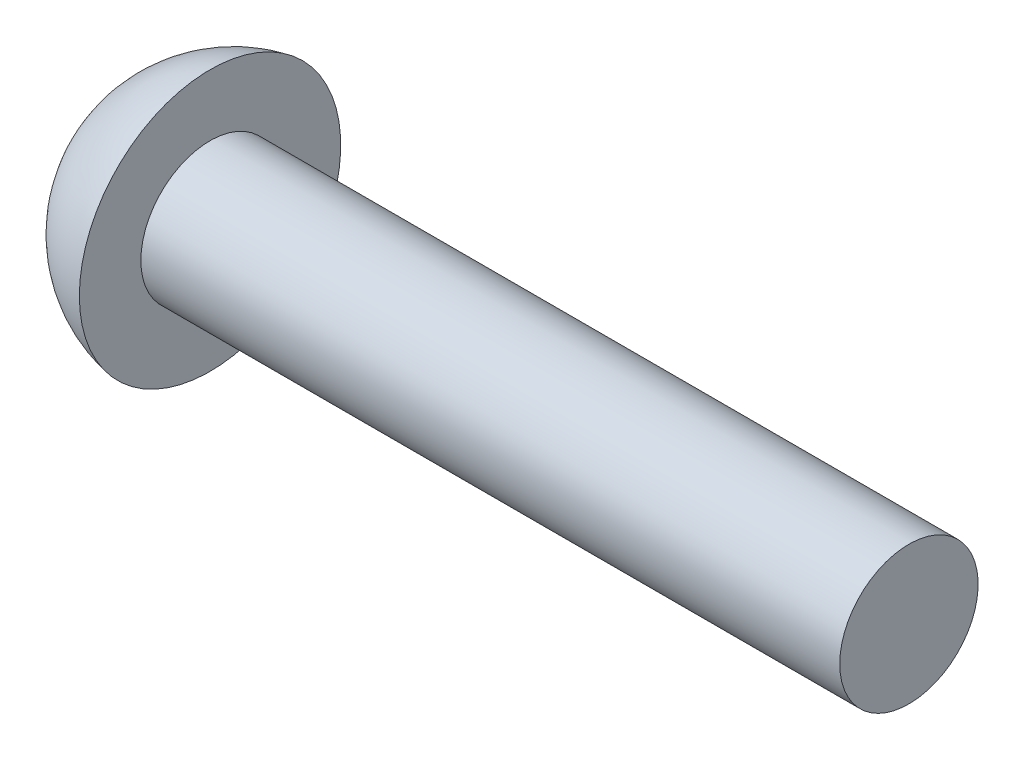
ISO-10303-21;
HEADER;
FILE_DESCRIPTION(('STEP AP214'),'2;1');
FILE_NAME('part.step','',(''),(''),'','','');
FILE_SCHEMA(('AUTOMOTIVE_DESIGN { 1 0 10303 214 1 1 1 1 }'));
ENDSEC;
DATA;
#1=APPLICATION_CONTEXT('core data for automotive mechanical design processes');
#2=APPLICATION_PROTOCOL_DEFINITION('international standard','automotive_design',2000,#1);
#3=PRODUCT_CONTEXT('',#1,'mechanical');
#4=PRODUCT('Part','Part','',(#3));
#5=PRODUCT_RELATED_PRODUCT_CATEGORY('part','',(#4));
#6=PRODUCT_DEFINITION_FORMATION('','',#4);
#7=PRODUCT_DEFINITION_CONTEXT('part definition',#1,'design');
#8=PRODUCT_DEFINITION('design','',#6,#7);
#9=PRODUCT_DEFINITION_SHAPE('','',#8);
#10=(LENGTH_UNIT() NAMED_UNIT(*) SI_UNIT(.MILLI.,.METRE.));
#11=(NAMED_UNIT(*) PLANE_ANGLE_UNIT() SI_UNIT($,.RADIAN.));
#12=(NAMED_UNIT(*) SI_UNIT($,.STERADIAN.) SOLID_ANGLE_UNIT());
#13=UNCERTAINTY_MEASURE_WITH_UNIT(LENGTH_MEASURE(1.E-05),#10,'distance_accuracy_value','');
#14=(GEOMETRIC_REPRESENTATION_CONTEXT(3) GLOBAL_UNCERTAINTY_ASSIGNED_CONTEXT((#13)) GLOBAL_UNIT_ASSIGNED_CONTEXT((#10,
#11,#12)) REPRESENTATION_CONTEXT('',''));
#15=CARTESIAN_POINT('',(0.,0.,0.));
#16=DIRECTION('',(0.,0.,1.));
#17=DIRECTION('',(1.,0.,0.));
#18=AXIS2_PLACEMENT_3D('',#15,#16,#17);
#19=CARTESIAN_POINT('',(2.41401762820514,0.,0.));
#20=DIRECTION('',(-1.,0.,0.));
#21=DIRECTION('',(0.,1.,0.));
#22=AXIS2_PLACEMENT_3D('',#19,#20,#21);
#23=SPHERICAL_SURFACE('',#22,2.41401762820514);
#24=CARTESIAN_POINT('',(1.9812,0.,0.));
#25=DIRECTION('',(-1.,0.,0.));
#26=DIRECTION('',(0.,0.,1.));
#27=AXIS2_PLACEMENT_3D('',#24,#25,#26);
#28=CIRCLE('',#27,2.3749);
#29=CARTESIAN_POINT('',(1.9812,0.,2.3749));
#30=VERTEX_POINT('',#29);
#31=EDGE_CURVE('E179',#30,#30,#28,.T.);
#32=ORIENTED_EDGE('',*,*,#31,.T.);
#33=EDGE_LOOP('',(#32));
#34=FACE_BOUND('',#33,.T.);
#35=CARTESIAN_POINT('',(2.42396078078378,0.,0.0986949959658133));
#36=DIRECTION('',(-0.100238850281225,0.,-0.994963402791428));
#37=DIRECTION('',(-0.994963402791428,0.,0.100238850281225));
#38=AXIS2_PLACEMENT_3D('',#35,#36,#37);
#39=CIRCLE('',#38,2.41197876043162);
#40=CARTESIAN_POINT('',(0.370965507232678,1.24902867511384,0.305526609345961));
#41=VERTEX_POINT('',#40);
#42=CARTESIAN_POINT('',(0.0478219323177577,0.338082118759031,0.338082118759031));
#43=VERTEX_POINT('',#42);
#44=EDGE_CURVE('E144',#41,#43,#39,.F.);
#45=ORIENTED_EDGE('',*,*,#44,.T.);
#46=CARTESIAN_POINT('',(2.42396078078378,0.0986949959658128,0.));
#47=DIRECTION('',(-0.100238850281226,-0.994963402791428,0.));
#48=DIRECTION('',(0.994963402791428,-0.100238850281226,0.));
#49=AXIS2_PLACEMENT_3D('',#46,#47,#48);
#50=CIRCLE('',#49,2.41197876043162);
#51=CARTESIAN_POINT('',(0.370965507232676,0.305526609345957,1.24902867511384));
#52=VERTEX_POINT('',#51);
#53=EDGE_CURVE('E125',#43,#52,#50,.F.);
#54=ORIENTED_EDGE('',*,*,#53,.T.);
#55=CARTESIAN_POINT('',(2.21583265520343,0.,-0.244763008131138));
#56=DIRECTION('',(0.629281647268382,0.,0.777177333953578));
#57=DIRECTION('',(0.777177333953578,0.,-0.629281647268382));
#58=AXIS2_PLACEMENT_3D('',#55,#56,#57);
#59=CIRCLE('',#58,2.39338565542874);
#60=CARTESIAN_POINT('',(0.370965507232673,-0.305526609345966,1.24902867511384));
#61=VERTEX_POINT('',#60);
#62=EDGE_CURVE('E136',#61,#52,#59,.F.);
#63=ORIENTED_EDGE('',*,*,#62,.F.);
#64=CARTESIAN_POINT('',(2.42396078078378,-0.0986949959658134,0.));
#65=DIRECTION('',(-0.100238850281225,0.994963402791428,0.));
#66=DIRECTION('',(-0.994963402791428,-0.100238850281225,0.));
#67=AXIS2_PLACEMENT_3D('',#64,#65,#66);
#68=CIRCLE('',#67,2.41197876043162);
#69=CARTESIAN_POINT('',(0.0478219323177551,-0.338082118759033,0.338082118759031));
#70=VERTEX_POINT('',#69);
#71=EDGE_CURVE('E219',#61,#70,#68,.F.);
#72=ORIENTED_EDGE('',*,*,#71,.T.);
#73=CARTESIAN_POINT('',(0.37096550723267,-1.24902867511384,0.305526609345961));
#74=VERTEX_POINT('',#73);
#75=EDGE_CURVE('E186',#70,#74,#39,.F.);
#76=ORIENTED_EDGE('',*,*,#75,.T.);
#77=CARTESIAN_POINT('',(2.21583265520343,0.244763008131134,0.));
#78=DIRECTION('',(0.629281647268382,-0.777177333953578,0.));
#79=DIRECTION('',(0.777177333953578,0.629281647268382,0.));
#80=AXIS2_PLACEMENT_3D('',#77,#78,#79);
#81=CIRCLE('',#80,2.39338565542874);
#82=CARTESIAN_POINT('',(0.370965507232671,-1.24902867511384,-0.305526609345962));
#83=VERTEX_POINT('',#82);
#84=EDGE_CURVE('E183',#83,#74,#81,.F.);
#85=ORIENTED_EDGE('',*,*,#84,.F.);
#86=CARTESIAN_POINT('',(2.42396078078378,0.,-0.0986949959658129));
#87=DIRECTION('',(-0.100238850281226,0.,0.994963402791428));
#88=DIRECTION('',(0.994963402791428,0.,0.100238850281226));
#89=AXIS2_PLACEMENT_3D('',#86,#87,#88);
#90=CIRCLE('',#89,2.41197876043162);
#91=CARTESIAN_POINT('',(0.0478219323177551,-0.33808211875903,-0.338082118759032));
#92=VERTEX_POINT('',#91);
#93=EDGE_CURVE('E189',#83,#92,#90,.F.);
#94=ORIENTED_EDGE('',*,*,#93,.T.);
#95=CARTESIAN_POINT('',(0.370965507232673,-0.305526609345957,-1.24902867511384));
#96=VERTEX_POINT('',#95);
#97=EDGE_CURVE('E225',#92,#96,#68,.F.);
#98=ORIENTED_EDGE('',*,*,#97,.T.);
#99=CARTESIAN_POINT('',(2.21583265520343,0.,0.244763008131138));
#100=DIRECTION('',(0.629281647268382,0.,-0.777177333953578));
#101=DIRECTION('',(-0.777177333953578,0.,-0.629281647268382));
#102=AXIS2_PLACEMENT_3D('',#99,#100,#101);
#103=CIRCLE('',#102,2.39338565542874);
#104=CARTESIAN_POINT('',(0.370965507232675,0.305526609345966,-1.24902867511384));
#105=VERTEX_POINT('',#104);
#106=EDGE_CURVE('E138',#105,#96,#103,.F.);
#107=ORIENTED_EDGE('',*,*,#106,.F.);
#108=CARTESIAN_POINT('',(0.0478219323177581,0.338082118759033,-0.338082118759032));
#109=VERTEX_POINT('',#108);
#110=EDGE_CURVE('E167',#105,#109,#50,.F.);
#111=ORIENTED_EDGE('',*,*,#110,.T.);
#112=CARTESIAN_POINT('',(0.370965507232678,1.24902867511384,-0.305526609345962));
#113=VERTEX_POINT('',#112);
#114=EDGE_CURVE('E76',#109,#113,#90,.F.);
#115=ORIENTED_EDGE('',*,*,#114,.T.);
#116=CARTESIAN_POINT('',(2.21583265520344,-0.244763008131142,0.));
#117=DIRECTION('',(0.629281647268382,0.777177333953578,0.));
#118=DIRECTION('',(-0.777177333953578,0.629281647268382,0.));
#119=AXIS2_PLACEMENT_3D('',#116,#117,#118);
#120=CIRCLE('',#119,2.39338565542874);
#121=EDGE_CURVE('E61',#41,#113,#120,.F.);
#122=ORIENTED_EDGE('',*,*,#121,.F.);
#123=EDGE_LOOP('',(#45,#54,#63,#72,#76,#85,#94,#98,#107,#111,#115,#122));
#124=FACE_BOUND('',#123,.T.);
#125=ADVANCED_FACE('F53',(#34,#124),#23,.T.);
#126=CARTESIAN_POINT('',(1.91354470046083,0.,-0.150117511520737));
#127=DIRECTION('',(-0.100238850281226,0.,0.994963402791428));
#128=DIRECTION('',(0.994963402791428,0.,0.100238850281226));
#129=AXIS2_PLACEMENT_3D('',#126,#127,#128);
#130=PLANE('',#129);
#131=ORIENTED_EDGE('',*,*,#114,.F.);
#132=DIRECTION('',(0.990002148884809,-0.0997390224622759,0.0997390224622755));
#133=VECTOR('',#132,1.);
#134=CARTESIAN_POINT('',(1.92836758075018,0.148624161640841,-0.14862416164084));
#135=LINE('',#134,#133);
#136=CARTESIAN_POINT('',(1.7018,0.171450000000001,-0.17145));
#137=VERTEX_POINT('',#136);
#138=EDGE_CURVE('E196',#109,#137,#135,.T.);
#139=ORIENTED_EDGE('',*,*,#138,.T.);
#140=DIRECTION('',(0.774805976248772,-0.62736155539546,0.0780588110399882));
#141=VECTOR('',#140,1.);
#142=CARTESIAN_POINT('',(0.,1.5494,-0.3429));
#143=LINE('',#142,#141);
#144=EDGE_CURVE('E148',#113,#137,#143,.T.);
#145=ORIENTED_EDGE('',*,*,#144,.F.);
#146=EDGE_LOOP('',(#131,#139,#145));
#147=FACE_BOUND('',#146,.T.);
#148=ADVANCED_FACE('F195',(#147),#130,.T.);
#149=DIRECTION('',(0.774805976248772,0.62736155539546,0.0780588110399882));
#150=VECTOR('',#149,1.);
#151=CARTESIAN_POINT('',(0.,-1.5494,-0.3429));
#152=LINE('',#151,#150);
#153=CARTESIAN_POINT('',(1.7018,-0.17145,-0.17145));
#154=VERTEX_POINT('',#153);
#155=EDGE_CURVE('E68',#83,#154,#152,.T.);
#156=ORIENTED_EDGE('',*,*,#155,.T.);
#157=DIRECTION('',(-0.990002148884809,-0.0997390224622746,-0.0997390224622755));
#158=VECTOR('',#157,1.);
#159=CARTESIAN_POINT('',(1.92836758075018,-0.14862416164084,-0.14862416164084));
#160=LINE('',#159,#158);
#161=EDGE_CURVE('E223',#154,#92,#160,.T.);
#162=ORIENTED_EDGE('',*,*,#161,.T.);
#163=ORIENTED_EDGE('',*,*,#93,.F.);
#164=EDGE_LOOP('',(#156,#162,#163));
#165=FACE_BOUND('',#164,.T.);
#166=ADVANCED_FACE('F255',(#165),#130,.T.);
#167=CARTESIAN_POINT('',(1.91354470046083,0.,0.150117511520737));
#168=DIRECTION('',(-0.100238850281225,0.,-0.994963402791428));
#169=DIRECTION('',(-0.994963402791428,0.,0.100238850281225));
#170=AXIS2_PLACEMENT_3D('',#167,#168,#169);
#171=PLANE('',#170);
#172=DIRECTION('',(0.774805976248772,-0.62736155539546,-0.0780588110399879));
#173=VECTOR('',#172,1.);
#174=CARTESIAN_POINT('',(0.,1.5494,0.342899999999999));
#175=LINE('',#174,#173);
#176=CARTESIAN_POINT('',(1.7018,0.171449999999999,0.171450000000001));
#177=VERTEX_POINT('',#176);
#178=EDGE_CURVE('E142',#41,#177,#175,.T.);
#179=ORIENTED_EDGE('',*,*,#178,.T.);
#180=DIRECTION('',(-0.990002148884809,0.0997390224622752,0.099739022462275));
#181=VECTOR('',#180,1.);
#182=CARTESIAN_POINT('',(1.92836758075018,0.14862416164084,0.14862416164084));
#183=LINE('',#182,#181);
#184=EDGE_CURVE('E11',#177,#43,#183,.T.);
#185=ORIENTED_EDGE('',*,*,#184,.T.);
#186=ORIENTED_EDGE('',*,*,#44,.F.);
#187=EDGE_LOOP('',(#179,#185,#186));
#188=FACE_BOUND('',#187,.T.);
#189=ADVANCED_FACE('F143',(#188),#171,.T.);
#190=ORIENTED_EDGE('',*,*,#75,.F.);
#191=DIRECTION('',(0.990002148884809,0.0997390224622754,-0.099739022462275));
#192=VECTOR('',#191,1.);
#193=CARTESIAN_POINT('',(1.92836758075018,-0.148624161640841,0.14862416164084));
#194=LINE('',#193,#192);
#195=CARTESIAN_POINT('',(1.7018,-0.17145,0.17145));
#196=VERTEX_POINT('',#195);
#197=EDGE_CURVE('E215',#70,#196,#194,.T.);
#198=ORIENTED_EDGE('',*,*,#197,.T.);
#199=DIRECTION('',(0.774805976248772,0.62736155539546,-0.0780588110399877));
#200=VECTOR('',#199,1.);
#201=CARTESIAN_POINT('',(0.,-1.5494,0.342899999999999));
#202=LINE('',#201,#200);
#203=EDGE_CURVE('E204',#74,#196,#202,.T.);
#204=ORIENTED_EDGE('',*,*,#203,.F.);
#205=EDGE_LOOP('',(#190,#198,#204));
#206=FACE_BOUND('',#205,.T.);
#207=ADVANCED_FACE('F214',(#206),#171,.T.);
#208=CARTESIAN_POINT('',(1.9812,1.25729999999999,0.));
#209=DIRECTION('',(-1.,0.,0.));
#210=DIRECTION('',(0.,0.,1.));
#211=AXIS2_PLACEMENT_3D('',#208,#209,#210);
#212=PLANE('',#211);
#213=ORIENTED_EDGE('',*,*,#31,.F.);
#214=EDGE_LOOP('',(#213));
#215=FACE_BOUND('',#214,.T.);
#216=CARTESIAN_POINT('',(1.9812,0.,0.));
#217=DIRECTION('',(-1.,0.,0.));
#218=DIRECTION('',(0.,0.,1.));
#219=AXIS2_PLACEMENT_3D('',#216,#217,#218);
#220=CIRCLE('',#219,1.25729999999999);
#221=CARTESIAN_POINT('',(1.9812,0.,1.25729999999999));
#222=VERTEX_POINT('',#221);
#223=EDGE_CURVE('E175',#222,#222,#220,.T.);
#224=ORIENTED_EDGE('',*,*,#223,.T.);
#225=EDGE_LOOP('',(#224));
#226=FACE_BOUND('',#225,.T.);
#227=ADVANCED_FACE('F278',(#215,#226),#212,.F.);
#228=CARTESIAN_POINT('',(0.,0.,0.));
#229=DIRECTION('',(-1.,0.,0.));
#230=DIRECTION('',(0.,0.,1.));
#231=AXIS2_PLACEMENT_3D('',#228,#229,#230);
#232=CYLINDRICAL_SURFACE('',#231,1.25729999999999);
#233=ORIENTED_EDGE('',*,*,#223,.F.);
#234=EDGE_LOOP('',(#233));
#235=FACE_BOUND('',#234,.T.);
#236=CARTESIAN_POINT('',(14.6812,0.,0.));
#237=DIRECTION('',(-1.,0.,0.));
#238=DIRECTION('',(0.,0.,1.));
#239=AXIS2_PLACEMENT_3D('',#236,#237,#238);
#240=CIRCLE('',#239,1.25729999999999);
#241=CARTESIAN_POINT('',(14.6812,0.,1.25729999999999));
#242=VERTEX_POINT('',#241);
#243=EDGE_CURVE('E171',#242,#242,#240,.T.);
#244=ORIENTED_EDGE('',*,*,#243,.T.);
#245=EDGE_LOOP('',(#244));
#246=FACE_BOUND('',#245,.T.);
#247=ADVANCED_FACE('F281',(#235,#246),#232,.T.);
#248=CARTESIAN_POINT('',(14.6812,0.,0.));
#249=DIRECTION('',(-1.,0.,0.));
#250=DIRECTION('',(0.,0.,1.));
#251=AXIS2_PLACEMENT_3D('',#248,#249,#250);
#252=PLANE('',#251);
#253=ORIENTED_EDGE('',*,*,#243,.F.);
#254=EDGE_LOOP('',(#253));
#255=FACE_BOUND('',#254,.T.);
#256=ADVANCED_FACE('F286',(#255),#252,.F.);
#257=CARTESIAN_POINT('',(1.7018,0.17145,-0.17145));
#258=DIRECTION('',(-1.,0.,0.));
#259=DIRECTION('',(0.,0.,1.));
#260=AXIS2_PLACEMENT_3D('',#257,#258,#259);
#261=PLANE('',#260);
#262=DIRECTION('',(0.,1.,0.));
#263=VECTOR('',#262,1.);
#264=CARTESIAN_POINT('',(1.7018,-0.17145,-0.17145));
#265=LINE('',#264,#263);
#266=EDGE_CURVE('E163',#154,#137,#265,.T.);
#267=ORIENTED_EDGE('',*,*,#266,.F.);
#268=DIRECTION('',(0.,0.,1.));
#269=VECTOR('',#268,1.);
#270=CARTESIAN_POINT('',(1.7018,-0.17145,-0.17145));
#271=LINE('',#270,#269);
#272=EDGE_CURVE('E156',#154,#196,#271,.T.);
#273=ORIENTED_EDGE('',*,*,#272,.T.);
#274=DIRECTION('',(0.,-1.,0.));
#275=VECTOR('',#274,1.);
#276=CARTESIAN_POINT('',(1.7018,0.17145,0.17145));
#277=LINE('',#276,#275);
#278=EDGE_CURVE('E133',#177,#196,#277,.T.);
#279=ORIENTED_EDGE('',*,*,#278,.F.);
#280=DIRECTION('',(0.,0.,-1.));
#281=VECTOR('',#280,1.);
#282=CARTESIAN_POINT('',(1.7018,0.17145,0.17145));
#283=LINE('',#282,#281);
#284=EDGE_CURVE('E155',#177,#137,#283,.T.);
#285=ORIENTED_EDGE('',*,*,#284,.T.);
#286=EDGE_LOOP('',(#267,#273,#279,#285));
#287=FACE_BOUND('',#286,.T.);
#288=ADVANCED_FACE('F154',(#287),#261,.T.);
#289=CARTESIAN_POINT('',(1.7018,0.17145,0.17145));
#290=DIRECTION('',(0.629281647268382,0.777177333953578,0.));
#291=DIRECTION('',(-0.777177333953578,0.629281647268382,0.));
#292=AXIS2_PLACEMENT_3D('',#289,#290,#291);
#293=PLANE('',#292);
#294=ORIENTED_EDGE('',*,*,#121,.T.);
#295=ORIENTED_EDGE('',*,*,#144,.T.);
#296=ORIENTED_EDGE('',*,*,#284,.F.);
#297=ORIENTED_EDGE('',*,*,#178,.F.);
#298=EDGE_LOOP('',(#294,#295,#296,#297));
#299=FACE_BOUND('',#298,.T.);
#300=ADVANCED_FACE('F160',(#299),#293,.F.);
#301=CARTESIAN_POINT('',(1.7018,-0.17145,-0.17145));
#302=DIRECTION('',(0.629281647268382,-0.777177333953578,0.));
#303=DIRECTION('',(0.777177333953578,0.629281647268382,0.));
#304=AXIS2_PLACEMENT_3D('',#301,#302,#303);
#305=PLANE('',#304);
#306=ORIENTED_EDGE('',*,*,#84,.T.);
#307=ORIENTED_EDGE('',*,*,#203,.T.);
#308=ORIENTED_EDGE('',*,*,#272,.F.);
#309=ORIENTED_EDGE('',*,*,#155,.F.);
#310=EDGE_LOOP('',(#306,#307,#308,#309));
#311=FACE_BOUND('',#310,.T.);
#312=ADVANCED_FACE('F209',(#311),#305,.F.);
#313=CARTESIAN_POINT('',(1.91354470046083,0.150117511520737,0.));
#314=DIRECTION('',(-0.100238850281226,-0.994963402791428,0.));
#315=DIRECTION('',(0.994963402791428,-0.100238850281226,0.));
#316=AXIS2_PLACEMENT_3D('',#313,#314,#315);
#317=PLANE('',#316);
#318=ORIENTED_EDGE('',*,*,#184,.F.);
#319=DIRECTION('',(0.774805976248772,-0.078058811039986,-0.627361555395461));
#320=VECTOR('',#319,1.);
#321=CARTESIAN_POINT('',(0.,0.342899999999994,1.5494));
#322=LINE('',#321,#320);
#323=EDGE_CURVE('E123',#52,#177,#322,.T.);
#324=ORIENTED_EDGE('',*,*,#323,.F.);
#325=ORIENTED_EDGE('',*,*,#53,.F.);
#326=EDGE_LOOP('',(#318,#324,#325));
#327=FACE_BOUND('',#326,.T.);
#328=ADVANCED_FACE('F122',(#327),#317,.T.);
#329=CARTESIAN_POINT('',(1.91354470046083,-0.150117511520737,0.));
#330=DIRECTION('',(-0.100238850281225,0.994963402791428,0.));
#331=DIRECTION('',(-0.994963402791428,-0.100238850281225,0.));
#332=AXIS2_PLACEMENT_3D('',#329,#330,#331);
#333=PLANE('',#332);
#334=DIRECTION('',(0.774805976248772,0.0780588110399901,-0.62736155539546));
#335=VECTOR('',#334,1.);
#336=CARTESIAN_POINT('',(0.,-0.342900000000005,1.5494));
#337=LINE('',#336,#335);
#338=EDGE_CURVE('E139',#61,#196,#337,.T.);
#339=ORIENTED_EDGE('',*,*,#338,.T.);
#340=ORIENTED_EDGE('',*,*,#197,.F.);
#341=ORIENTED_EDGE('',*,*,#71,.F.);
#342=EDGE_LOOP('',(#339,#340,#341));
#343=FACE_BOUND('',#342,.T.);
#344=ADVANCED_FACE('F258',(#343),#333,.T.);
#345=CARTESIAN_POINT('',(1.7018,-0.171450000000001,0.171449999999999));
#346=DIRECTION('',(0.629281647268382,0.,0.777177333953578));
#347=DIRECTION('',(-0.777177333953578,0.,0.629281647268382));
#348=AXIS2_PLACEMENT_3D('',#345,#346,#347);
#349=PLANE('',#348);
#350=ORIENTED_EDGE('',*,*,#62,.T.);
#351=ORIENTED_EDGE('',*,*,#323,.T.);
#352=ORIENTED_EDGE('',*,*,#278,.T.);
#353=ORIENTED_EDGE('',*,*,#338,.F.);
#354=EDGE_LOOP('',(#350,#351,#352,#353));
#355=FACE_BOUND('',#354,.T.);
#356=ADVANCED_FACE('F130',(#355),#349,.F.);
#357=DIRECTION('',(0.774805976248772,-0.0780588110399904,0.62736155539546));
#358=VECTOR('',#357,1.);
#359=CARTESIAN_POINT('',(0.,0.342900000000005,-1.5494));
#360=LINE('',#359,#358);
#361=EDGE_CURVE('E241',#105,#137,#360,.T.);
#362=ORIENTED_EDGE('',*,*,#361,.T.);
#363=ORIENTED_EDGE('',*,*,#138,.F.);
#364=ORIENTED_EDGE('',*,*,#110,.F.);
#365=EDGE_LOOP('',(#362,#363,#364));
#366=FACE_BOUND('',#365,.T.);
#367=ADVANCED_FACE('F240',(#366),#317,.T.);
#368=ORIENTED_EDGE('',*,*,#161,.F.);
#369=DIRECTION('',(0.774805976248772,0.0780588110399855,0.627361555395461));
#370=VECTOR('',#369,1.);
#371=CARTESIAN_POINT('',(0.,-0.342899999999993,-1.5494));
#372=LINE('',#371,#370);
#373=EDGE_CURVE('E246',#96,#154,#372,.T.);
#374=ORIENTED_EDGE('',*,*,#373,.F.);
#375=ORIENTED_EDGE('',*,*,#97,.F.);
#376=EDGE_LOOP('',(#368,#374,#375));
#377=FACE_BOUND('',#376,.T.);
#378=ADVANCED_FACE('F253',(#377),#333,.T.);
#379=CARTESIAN_POINT('',(1.7018,0.171450000000001,-0.17145));
#380=DIRECTION('',(0.629281647268382,0.,-0.777177333953578));
#381=DIRECTION('',(0.777177333953578,0.,0.629281647268382));
#382=AXIS2_PLACEMENT_3D('',#379,#380,#381);
#383=PLANE('',#382);
#384=ORIENTED_EDGE('',*,*,#106,.T.);
#385=ORIENTED_EDGE('',*,*,#373,.T.);
#386=ORIENTED_EDGE('',*,*,#266,.T.);
#387=ORIENTED_EDGE('',*,*,#361,.F.);
#388=EDGE_LOOP('',(#384,#385,#386,#387));
#389=FACE_BOUND('',#388,.T.);
#390=ADVANCED_FACE('F243',(#389),#383,.F.);
#391=CLOSED_SHELL('',(#125,#148,#166,#189,#207,#227,#247,#256,#288,#300,#312,#328,#344,#356,
#367,#378,#390));
#392=MANIFOLD_SOLID_BREP('B2',#391);
#393=ADVANCED_BREP_SHAPE_REPRESENTATION('',(#18,#392),#14);
#394=SHAPE_DEFINITION_REPRESENTATION(#9,#393);
ENDSEC;
END-ISO-10303-21;
